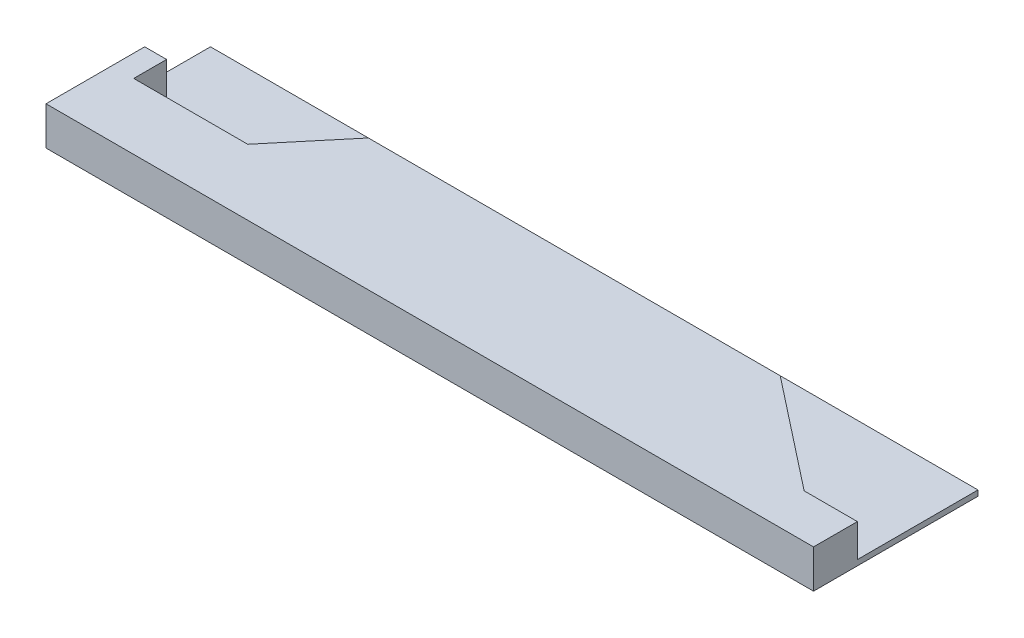
ISO-10303-21;
HEADER;
FILE_DESCRIPTION(('STEP AP214'),'2;1');
FILE_NAME('part.step','',(''),(''),'','','');
FILE_SCHEMA(('AUTOMOTIVE_DESIGN { 1 0 10303 214 1 1 1 1 }'));
ENDSEC;
DATA;
#1=APPLICATION_CONTEXT('core data for automotive mechanical design processes');
#2=APPLICATION_PROTOCOL_DEFINITION('international standard','automotive_design',2000,#1);
#3=PRODUCT_CONTEXT('',#1,'mechanical');
#4=PRODUCT('Part','Part','',(#3));
#5=PRODUCT_RELATED_PRODUCT_CATEGORY('part','',(#4));
#6=PRODUCT_DEFINITION_FORMATION('','',#4);
#7=PRODUCT_DEFINITION_CONTEXT('part definition',#1,'design');
#8=PRODUCT_DEFINITION('design','',#6,#7);
#9=PRODUCT_DEFINITION_SHAPE('','',#8);
#10=(LENGTH_UNIT() NAMED_UNIT(*) SI_UNIT(.MILLI.,.METRE.));
#11=(NAMED_UNIT(*) PLANE_ANGLE_UNIT() SI_UNIT($,.RADIAN.));
#12=(NAMED_UNIT(*) SI_UNIT($,.STERADIAN.) SOLID_ANGLE_UNIT());
#13=UNCERTAINTY_MEASURE_WITH_UNIT(LENGTH_MEASURE(1.E-05),#10,'distance_accuracy_value','');
#14=(GEOMETRIC_REPRESENTATION_CONTEXT(3) GLOBAL_UNCERTAINTY_ASSIGNED_CONTEXT((#13)) GLOBAL_UNIT_ASSIGNED_CONTEXT((#10,
#11,#12)) REPRESENTATION_CONTEXT('',''));
#15=CARTESIAN_POINT('',(0.,0.,0.));
#16=DIRECTION('',(0.,0.,1.));
#17=DIRECTION('',(1.,0.,0.));
#18=AXIS2_PLACEMENT_3D('',#15,#16,#17);
#19=CARTESIAN_POINT('',(0.,-19.05,38.0999999999999));
#20=DIRECTION('',(0.,0.,1.));
#21=DIRECTION('',(1.,0.,0.));
#22=AXIS2_PLACEMENT_3D('',#19,#20,#21);
#23=PLANE('',#22);
#24=DIRECTION('',(0.,1.,0.));
#25=VECTOR('',#24,1.);
#26=CARTESIAN_POINT('',(-12.7,-19.05,38.0999999999999));
#27=LINE('',#26,#25);
#28=CARTESIAN_POINT('',(-12.7,-22.225,38.0999999999999));
#29=VERTEX_POINT('',#28);
#30=CARTESIAN_POINT('',(-12.7,0.,38.0999999999999));
#31=VERTEX_POINT('',#30);
#32=EDGE_CURVE('E120',#29,#31,#27,.T.);
#33=ORIENTED_EDGE('',*,*,#32,.F.);
#34=DIRECTION('',(-1.,0.,0.));
#35=VECTOR('',#34,1.);
#36=CARTESIAN_POINT('',(0.,-22.225,38.0999999999999));
#37=LINE('',#36,#35);
#38=CARTESIAN_POINT('',(431.8,-22.225,38.0999999999999));
#39=VERTEX_POINT('',#38);
#40=EDGE_CURVE('E226',#39,#29,#37,.T.);
#41=ORIENTED_EDGE('',*,*,#40,.F.);
#42=DIRECTION('',(0.,-1.,0.));
#43=VECTOR('',#42,1.);
#44=CARTESIAN_POINT('',(431.8,6.35,38.0999999999999));
#45=LINE('',#44,#43);
#46=CARTESIAN_POINT('',(431.8,0.,38.0999999999999));
#47=VERTEX_POINT('',#46);
#48=EDGE_CURVE('E147',#47,#39,#45,.T.);
#49=ORIENTED_EDGE('',*,*,#48,.F.);
#50=DIRECTION('',(1.,0.,0.));
#51=VECTOR('',#50,1.);
#52=CARTESIAN_POINT('',(0.,0.,38.0999999999999));
#53=LINE('',#52,#51);
#54=EDGE_CURVE('E150',#31,#47,#53,.T.);
#55=ORIENTED_EDGE('',*,*,#54,.F.);
#56=EDGE_LOOP('',(#33,#41,#49,#55));
#57=FACE_BOUND('',#56,.T.);
#58=ADVANCED_FACE('F36',(#57),#23,.T.);
#59=CARTESIAN_POINT('',(0.,0.,0.));
#60=DIRECTION('',(0.,-1.,0.));
#61=DIRECTION('',(0.,0.,-1.));
#62=AXIS2_PLACEMENT_3D('',#59,#60,#61);
#63=PLANE('',#62);
#64=DIRECTION('',(0.,0.,1.));
#65=VECTOR('',#64,1.);
#66=CARTESIAN_POINT('',(431.8,0.,0.));
#67=LINE('',#66,#65);
#68=CARTESIAN_POINT('',(431.8,0.,12.7));
#69=VERTEX_POINT('',#68);
#70=EDGE_CURVE('E12',#69,#47,#67,.T.);
#71=ORIENTED_EDGE('',*,*,#70,.F.);
#72=DIRECTION('',(-1.,0.,0.));
#73=VECTOR('',#72,1.);
#74=CARTESIAN_POINT('',(0.,0.,12.7));
#75=LINE('',#74,#73);
#76=CARTESIAN_POINT('',(400.965853893521,0.,12.7));
#77=VERTEX_POINT('',#76);
#78=EDGE_CURVE('E112',#69,#77,#75,.T.);
#79=ORIENTED_EDGE('',*,*,#78,.T.);
#80=DIRECTION('',(-0.786318338822423,0.,-0.617821551931904));
#81=VECTOR('',#80,1.);
#82=CARTESIAN_POINT('',(146.880341706991,0.,-186.938616717988));
#83=LINE('',#82,#81);
#84=CARTESIAN_POINT('',(336.311308438975,0.,-38.1));
#85=VERTEX_POINT('',#84);
#86=EDGE_CURVE('E93',#77,#85,#83,.T.);
#87=ORIENTED_EDGE('',*,*,#86,.T.);
#88=DIRECTION('',(-1.,0.,0.));
#89=VECTOR('',#88,1.);
#90=CARTESIAN_POINT('',(0.,0.,-38.1));
#91=LINE('',#90,#89);
#92=CARTESIAN_POINT('',(97.808358015523,0.,-38.1));
#93=VERTEX_POINT('',#92);
#94=EDGE_CURVE('E100',#85,#93,#91,.T.);
#95=ORIENTED_EDGE('',*,*,#94,.T.);
#96=DIRECTION('',(-0.640428628069395,0.,0.768017690127742));
#97=VECTOR('',#96,1.);
#98=CARTESIAN_POINT('',(38.9524889958213,0.,32.4813990721136));
#99=LINE('',#98,#97);
#100=CARTESIAN_POINT('',(66.037825847982,0.,0.));
#101=VERTEX_POINT('',#100);
#102=EDGE_CURVE('E106',#93,#101,#99,.T.);
#103=ORIENTED_EDGE('',*,*,#102,.T.);
#104=DIRECTION('',(-1.,0.,0.));
#105=VECTOR('',#104,1.);
#106=CARTESIAN_POINT('',(0.,0.,0.));
#107=LINE('',#106,#105);
#108=CARTESIAN_POINT('',(0.,0.,0.));
#109=VERTEX_POINT('',#108);
#110=EDGE_CURVE('E170',#101,#109,#107,.T.);
#111=ORIENTED_EDGE('',*,*,#110,.T.);
#112=DIRECTION('',(0.,0.,-1.));
#113=VECTOR('',#112,1.);
#114=CARTESIAN_POINT('',(0.,0.,0.));
#115=LINE('',#114,#113);
#116=CARTESIAN_POINT('',(0.,0.,-19.05));
#117=VERTEX_POINT('',#116);
#118=EDGE_CURVE('E167',#109,#117,#115,.T.);
#119=ORIENTED_EDGE('',*,*,#118,.T.);
#120=DIRECTION('',(-1.,0.,0.));
#121=VECTOR('',#120,1.);
#122=CARTESIAN_POINT('',(0.,0.,-19.05));
#123=LINE('',#122,#121);
#124=CARTESIAN_POINT('',(-12.7,0.,-19.05));
#125=VERTEX_POINT('',#124);
#126=EDGE_CURVE('E44',#117,#125,#123,.T.);
#127=ORIENTED_EDGE('',*,*,#126,.T.);
#128=DIRECTION('',(0.,0.,-1.));
#129=VECTOR('',#128,1.);
#130=CARTESIAN_POINT('',(-12.7,0.,0.));
#131=LINE('',#130,#129);
#132=EDGE_CURVE('E163',#31,#125,#131,.T.);
#133=ORIENTED_EDGE('',*,*,#132,.F.);
#134=ORIENTED_EDGE('',*,*,#54,.T.);
#135=EDGE_LOOP('',(#71,#79,#87,#95,#103,#111,#119,#127,#133,#134));
#136=FACE_BOUND('',#135,.T.);
#137=ADVANCED_FACE('F110',(#136),#63,.F.);
#138=CARTESIAN_POINT('',(0.,-19.05,12.7));
#139=DIRECTION('',(0.,0.,-1.));
#140=DIRECTION('',(-1.,0.,0.));
#141=AXIS2_PLACEMENT_3D('',#138,#139,#140);
#142=PLANE('',#141);
#143=ORIENTED_EDGE('',*,*,#78,.F.);
#144=DIRECTION('',(0.,1.,0.));
#145=VECTOR('',#144,1.);
#146=CARTESIAN_POINT('',(431.8,-19.05,12.7));
#147=LINE('',#146,#145);
#148=CARTESIAN_POINT('',(431.8,-19.05,12.6999999999999));
#149=VERTEX_POINT('',#148);
#150=EDGE_CURVE('E130',#149,#69,#147,.T.);
#151=ORIENTED_EDGE('',*,*,#150,.F.);
#152=DIRECTION('',(-1.,0.,0.));
#153=VECTOR('',#152,1.);
#154=CARTESIAN_POINT('',(0.,-19.05,12.7));
#155=LINE('',#154,#153);
#156=CARTESIAN_POINT('',(400.965853893521,-19.05,12.7));
#157=VERTEX_POINT('',#156);
#158=EDGE_CURVE('E113',#149,#157,#155,.T.);
#159=ORIENTED_EDGE('',*,*,#158,.T.);
#160=DIRECTION('',(0.,1.,0.));
#161=VECTOR('',#160,1.);
#162=CARTESIAN_POINT('',(400.965853893521,-19.05,12.7));
#163=LINE('',#162,#161);
#164=EDGE_CURVE('E97',#157,#77,#163,.T.);
#165=ORIENTED_EDGE('',*,*,#164,.T.);
#166=EDGE_LOOP('',(#143,#151,#159,#165));
#167=FACE_BOUND('',#166,.T.);
#168=ADVANCED_FACE('F264',(#167),#142,.T.);
#169=CARTESIAN_POINT('',(0.,-19.05,0.));
#170=DIRECTION('',(1.,0.,0.));
#171=DIRECTION('',(0.,0.,-1.));
#172=AXIS2_PLACEMENT_3D('',#169,#170,#171);
#173=PLANE('',#172);
#174=ORIENTED_EDGE('',*,*,#118,.F.);
#175=DIRECTION('',(0.,1.,0.));
#176=VECTOR('',#175,1.);
#177=CARTESIAN_POINT('',(0.,-19.05,0.));
#178=LINE('',#177,#176);
#179=CARTESIAN_POINT('',(0.,-19.05,0.));
#180=VERTEX_POINT('',#179);
#181=EDGE_CURVE('E125',#180,#109,#178,.T.);
#182=ORIENTED_EDGE('',*,*,#181,.F.);
#183=DIRECTION('',(0.,0.,-1.));
#184=VECTOR('',#183,1.);
#185=CARTESIAN_POINT('',(0.,-19.05,0.));
#186=LINE('',#185,#184);
#187=CARTESIAN_POINT('',(0.,-19.05,-19.05));
#188=VERTEX_POINT('',#187);
#189=EDGE_CURVE('E116',#180,#188,#186,.T.);
#190=ORIENTED_EDGE('',*,*,#189,.T.);
#191=DIRECTION('',(0.,1.,0.));
#192=VECTOR('',#191,1.);
#193=CARTESIAN_POINT('',(0.,-19.05,-19.05));
#194=LINE('',#193,#192);
#195=EDGE_CURVE('E127',#188,#117,#194,.T.);
#196=ORIENTED_EDGE('',*,*,#195,.T.);
#197=EDGE_LOOP('',(#174,#182,#190,#196));
#198=FACE_BOUND('',#197,.T.);
#199=ADVANCED_FACE('F185',(#198),#173,.T.);
#200=CARTESIAN_POINT('',(0.,-19.05,0.));
#201=DIRECTION('',(0.,0.,-1.));
#202=DIRECTION('',(-1.,0.,0.));
#203=AXIS2_PLACEMENT_3D('',#200,#201,#202);
#204=PLANE('',#203);
#205=ORIENTED_EDGE('',*,*,#110,.F.);
#206=DIRECTION('',(0.,1.,0.));
#207=VECTOR('',#206,1.);
#208=CARTESIAN_POINT('',(66.037825847982,-19.05,0.));
#209=LINE('',#208,#207);
#210=CARTESIAN_POINT('',(66.037825847982,-19.05,0.));
#211=VERTEX_POINT('',#210);
#212=EDGE_CURVE('E123',#211,#101,#209,.T.);
#213=ORIENTED_EDGE('',*,*,#212,.F.);
#214=DIRECTION('',(-1.,0.,0.));
#215=VECTOR('',#214,1.);
#216=CARTESIAN_POINT('',(0.,-19.05,0.));
#217=LINE('',#216,#215);
#218=EDGE_CURVE('E153',#211,#180,#217,.T.);
#219=ORIENTED_EDGE('',*,*,#218,.T.);
#220=ORIENTED_EDGE('',*,*,#181,.T.);
#221=EDGE_LOOP('',(#205,#213,#219,#220));
#222=FACE_BOUND('',#221,.T.);
#223=ADVANCED_FACE('F179',(#222),#204,.T.);
#224=CARTESIAN_POINT('',(38.9524889958213,-19.05,32.4813990721136));
#225=DIRECTION('',(-0.768017690127742,0.,-0.640428628069395));
#226=DIRECTION('',(-0.640428628069395,0.,0.768017690127742));
#227=AXIS2_PLACEMENT_3D('',#224,#225,#226);
#228=PLANE('',#227);
#229=ORIENTED_EDGE('',*,*,#102,.F.);
#230=DIRECTION('',(0.,1.,0.));
#231=VECTOR('',#230,1.);
#232=CARTESIAN_POINT('',(97.808358015523,-19.05,-38.1));
#233=LINE('',#232,#231);
#234=CARTESIAN_POINT('',(97.808358015523,-19.05,-38.1));
#235=VERTEX_POINT('',#234);
#236=EDGE_CURVE('E96',#235,#93,#233,.T.);
#237=ORIENTED_EDGE('',*,*,#236,.F.);
#238=DIRECTION('',(-0.640428628069395,0.,0.768017690127742));
#239=VECTOR('',#238,1.);
#240=CARTESIAN_POINT('',(38.9524889958213,-19.05,32.4813990721136));
#241=LINE('',#240,#239);
#242=EDGE_CURVE('E156',#235,#211,#241,.T.);
#243=ORIENTED_EDGE('',*,*,#242,.T.);
#244=ORIENTED_EDGE('',*,*,#212,.T.);
#245=EDGE_LOOP('',(#229,#237,#243,#244));
#246=FACE_BOUND('',#245,.T.);
#247=ADVANCED_FACE('F174',(#246),#228,.T.);
#248=CARTESIAN_POINT('',(0.,-19.05,-38.1));
#249=DIRECTION('',(0.,0.,-1.));
#250=DIRECTION('',(-1.,0.,0.));
#251=AXIS2_PLACEMENT_3D('',#248,#249,#250);
#252=PLANE('',#251);
#253=ORIENTED_EDGE('',*,*,#94,.F.);
#254=DIRECTION('',(0.,1.,0.));
#255=VECTOR('',#254,1.);
#256=CARTESIAN_POINT('',(336.311308438975,-19.05,-38.1));
#257=LINE('',#256,#255);
#258=CARTESIAN_POINT('',(336.311308438975,-19.05,-38.1));
#259=VERTEX_POINT('',#258);
#260=EDGE_CURVE('E88',#259,#85,#257,.T.);
#261=ORIENTED_EDGE('',*,*,#260,.F.);
#262=DIRECTION('',(-1.,0.,0.));
#263=VECTOR('',#262,1.);
#264=CARTESIAN_POINT('',(0.,-19.05,-38.1));
#265=LINE('',#264,#263);
#266=EDGE_CURVE('E61',#259,#235,#265,.T.);
#267=ORIENTED_EDGE('',*,*,#266,.T.);
#268=ORIENTED_EDGE('',*,*,#236,.T.);
#269=EDGE_LOOP('',(#253,#261,#267,#268));
#270=FACE_BOUND('',#269,.T.);
#271=ADVANCED_FACE('F101',(#270),#252,.T.);
#272=CARTESIAN_POINT('',(-12.7,-19.05,0.));
#273=DIRECTION('',(1.,0.,0.));
#274=DIRECTION('',(0.,0.,-1.));
#275=AXIS2_PLACEMENT_3D('',#272,#273,#274);
#276=PLANE('',#275);
#277=ORIENTED_EDGE('',*,*,#132,.T.);
#278=DIRECTION('',(0.,-1.,0.));
#279=VECTOR('',#278,1.);
#280=CARTESIAN_POINT('',(-12.7,6.35,-19.05));
#281=LINE('',#280,#279);
#282=CARTESIAN_POINT('',(-12.7,-19.05,-19.05));
#283=VERTEX_POINT('',#282);
#284=EDGE_CURVE('E52',#125,#283,#281,.T.);
#285=ORIENTED_EDGE('',*,*,#284,.T.);
#286=DIRECTION('',(0.,0.,1.));
#287=VECTOR('',#286,1.);
#288=CARTESIAN_POINT('',(-12.7,-19.05,0.));
#289=LINE('',#288,#287);
#290=CARTESIAN_POINT('',(-12.7,-19.05,-57.15));
#291=VERTEX_POINT('',#290);
#292=EDGE_CURVE('E144',#291,#283,#289,.T.);
#293=ORIENTED_EDGE('',*,*,#292,.F.);
#294=DIRECTION('',(0.,1.,0.));
#295=VECTOR('',#294,1.);
#296=CARTESIAN_POINT('',(-12.7,-22.225,-57.15));
#297=LINE('',#296,#295);
#298=CARTESIAN_POINT('',(-12.7,-22.225,-57.15));
#299=VERTEX_POINT('',#298);
#300=EDGE_CURVE('E140',#299,#291,#297,.T.);
#301=ORIENTED_EDGE('',*,*,#300,.F.);
#302=DIRECTION('',(0.,0.,1.));
#303=VECTOR('',#302,1.);
#304=CARTESIAN_POINT('',(-12.7,-22.225,0.));
#305=LINE('',#304,#303);
#306=EDGE_CURVE('E233',#299,#29,#305,.T.);
#307=ORIENTED_EDGE('',*,*,#306,.T.);
#308=ORIENTED_EDGE('',*,*,#32,.T.);
#309=EDGE_LOOP('',(#277,#285,#293,#301,#307,#308));
#310=FACE_BOUND('',#309,.T.);
#311=ADVANCED_FACE('F238',(#310),#276,.F.);
#312=CARTESIAN_POINT('',(146.880341706991,-19.05,-186.938616717988));
#313=DIRECTION('',(0.617821551931904,0.,-0.786318338822423));
#314=DIRECTION('',(-0.786318338822423,0.,-0.617821551931904));
#315=AXIS2_PLACEMENT_3D('',#312,#313,#314);
#316=PLANE('',#315);
#317=ORIENTED_EDGE('',*,*,#86,.F.);
#318=ORIENTED_EDGE('',*,*,#164,.F.);
#319=DIRECTION('',(-0.786318338822423,0.,-0.617821551931904));
#320=VECTOR('',#319,1.);
#321=CARTESIAN_POINT('',(146.880341706991,-19.05,-186.938616717988));
#322=LINE('',#321,#320);
#323=EDGE_CURVE('E94',#157,#259,#322,.T.);
#324=ORIENTED_EDGE('',*,*,#323,.T.);
#325=ORIENTED_EDGE('',*,*,#260,.T.);
#326=EDGE_LOOP('',(#317,#318,#324,#325));
#327=FACE_BOUND('',#326,.T.);
#328=ADVANCED_FACE('F90',(#327),#316,.T.);
#329=CARTESIAN_POINT('',(0.,6.35,-19.05));
#330=DIRECTION('',(0.,0.,1.));
#331=DIRECTION('',(1.,0.,0.));
#332=AXIS2_PLACEMENT_3D('',#329,#330,#331);
#333=PLANE('',#332);
#334=ORIENTED_EDGE('',*,*,#195,.F.);
#335=DIRECTION('',(-1.,0.,0.));
#336=VECTOR('',#335,1.);
#337=CARTESIAN_POINT('',(0.,-19.05,-19.05));
#338=LINE('',#337,#336);
#339=EDGE_CURVE('E138',#188,#283,#338,.T.);
#340=ORIENTED_EDGE('',*,*,#339,.T.);
#341=ORIENTED_EDGE('',*,*,#284,.F.);
#342=ORIENTED_EDGE('',*,*,#126,.F.);
#343=EDGE_LOOP('',(#334,#340,#341,#342));
#344=FACE_BOUND('',#343,.T.);
#345=ADVANCED_FACE('F265',(#344),#333,.F.);
#346=CARTESIAN_POINT('',(431.8,6.35,0.));
#347=DIRECTION('',(1.,0.,0.));
#348=DIRECTION('',(0.,0.,-1.));
#349=AXIS2_PLACEMENT_3D('',#346,#347,#348);
#350=PLANE('',#349);
#351=ORIENTED_EDGE('',*,*,#70,.T.);
#352=ORIENTED_EDGE('',*,*,#48,.T.);
#353=DIRECTION('',(0.,0.,1.));
#354=VECTOR('',#353,1.);
#355=CARTESIAN_POINT('',(431.8,-22.225,0.));
#356=LINE('',#355,#354);
#357=CARTESIAN_POINT('',(431.8,-22.225,-57.15));
#358=VERTEX_POINT('',#357);
#359=EDGE_CURVE('E235',#358,#39,#356,.T.);
#360=ORIENTED_EDGE('',*,*,#359,.F.);
#361=DIRECTION('',(0.,1.,0.));
#362=VECTOR('',#361,1.);
#363=CARTESIAN_POINT('',(431.8,-22.225,-57.15));
#364=LINE('',#363,#362);
#365=CARTESIAN_POINT('',(431.8,-19.05,-57.15));
#366=VERTEX_POINT('',#365);
#367=EDGE_CURVE('E245',#358,#366,#364,.T.);
#368=ORIENTED_EDGE('',*,*,#367,.T.);
#369=DIRECTION('',(0.,0.,1.));
#370=VECTOR('',#369,1.);
#371=CARTESIAN_POINT('',(431.8,-19.05,0.));
#372=LINE('',#371,#370);
#373=EDGE_CURVE('E236',#366,#149,#372,.T.);
#374=ORIENTED_EDGE('',*,*,#373,.T.);
#375=ORIENTED_EDGE('',*,*,#150,.T.);
#376=EDGE_LOOP('',(#351,#352,#360,#368,#374,#375));
#377=FACE_BOUND('',#376,.T.);
#378=ADVANCED_FACE('F260',(#377),#350,.T.);
#379=CARTESIAN_POINT('',(0.,-22.225,-57.15));
#380=DIRECTION('',(0.,0.,1.));
#381=DIRECTION('',(1.,0.,0.));
#382=AXIS2_PLACEMENT_3D('',#379,#380,#381);
#383=PLANE('',#382);
#384=DIRECTION('',(1.,0.,0.));
#385=VECTOR('',#384,1.);
#386=CARTESIAN_POINT('',(0.,-19.05,-57.15));
#387=LINE('',#386,#385);
#388=EDGE_CURVE('E248',#291,#366,#387,.T.);
#389=ORIENTED_EDGE('',*,*,#388,.T.);
#390=ORIENTED_EDGE('',*,*,#367,.F.);
#391=DIRECTION('',(1.,0.,0.));
#392=VECTOR('',#391,1.);
#393=CARTESIAN_POINT('',(0.,-22.225,-57.15));
#394=LINE('',#393,#392);
#395=EDGE_CURVE('E241',#299,#358,#394,.T.);
#396=ORIENTED_EDGE('',*,*,#395,.F.);
#397=ORIENTED_EDGE('',*,*,#300,.T.);
#398=EDGE_LOOP('',(#389,#390,#396,#397));
#399=FACE_BOUND('',#398,.T.);
#400=ADVANCED_FACE('F272',(#399),#383,.F.);
#401=CARTESIAN_POINT('',(0.,-22.225,0.));
#402=DIRECTION('',(0.,-1.,0.));
#403=DIRECTION('',(0.,0.,-1.));
#404=AXIS2_PLACEMENT_3D('',#401,#402,#403);
#405=PLANE('',#404);
#406=ORIENTED_EDGE('',*,*,#40,.T.);
#407=ORIENTED_EDGE('',*,*,#306,.F.);
#408=ORIENTED_EDGE('',*,*,#395,.T.);
#409=ORIENTED_EDGE('',*,*,#359,.T.);
#410=EDGE_LOOP('',(#406,#407,#408,#409));
#411=FACE_BOUND('',#410,.T.);
#412=ADVANCED_FACE('F232',(#411),#405,.T.);
#413=CARTESIAN_POINT('',(0.,-19.05,0.));
#414=DIRECTION('',(0.,-1.,0.));
#415=DIRECTION('',(0.,0.,-1.));
#416=AXIS2_PLACEMENT_3D('',#413,#414,#415);
#417=PLANE('',#416);
#418=ORIENTED_EDGE('',*,*,#158,.F.);
#419=ORIENTED_EDGE('',*,*,#373,.F.);
#420=ORIENTED_EDGE('',*,*,#388,.F.);
#421=ORIENTED_EDGE('',*,*,#292,.T.);
#422=ORIENTED_EDGE('',*,*,#339,.F.);
#423=ORIENTED_EDGE('',*,*,#189,.F.);
#424=ORIENTED_EDGE('',*,*,#218,.F.);
#425=ORIENTED_EDGE('',*,*,#242,.F.);
#426=ORIENTED_EDGE('',*,*,#266,.F.);
#427=ORIENTED_EDGE('',*,*,#323,.F.);
#428=EDGE_LOOP('',(#418,#419,#420,#421,#422,#423,#424,#425,#426,#427));
#429=FACE_BOUND('',#428,.T.);
#430=ADVANCED_FACE('F262',(#429),#417,.F.);
#431=CLOSED_SHELL('',(#58,#137,#168,#199,#223,#247,#271,#311,#328,#345,#378,#400,#412,#430));
#432=MANIFOLD_SOLID_BREP('B2',#431);
#433=ADVANCED_BREP_SHAPE_REPRESENTATION('',(#18,#432),#14);
#434=SHAPE_DEFINITION_REPRESENTATION(#9,#433);
ENDSEC;
END-ISO-10303-21;
